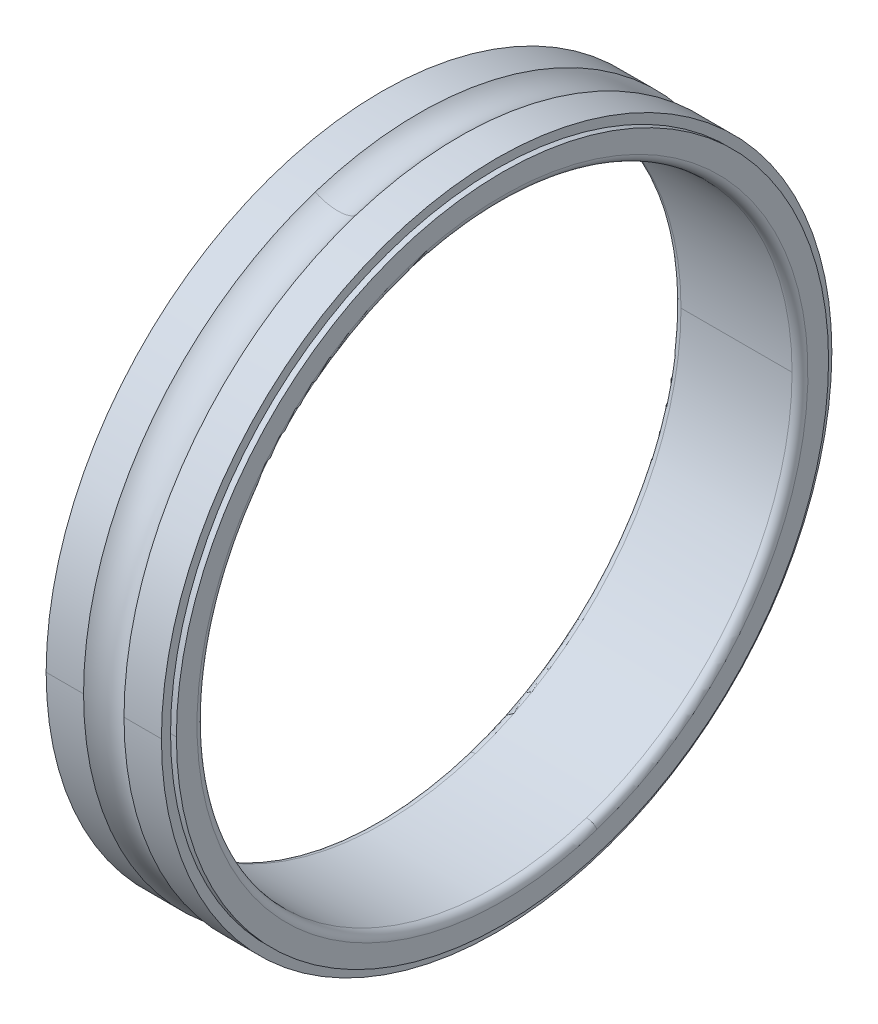
ISO-10303-21;
HEADER;
FILE_DESCRIPTION(('STEP AP214'),'2;1');
FILE_NAME('part.step','',(''),(''),'','','');
FILE_SCHEMA(('AUTOMOTIVE_DESIGN { 1 0 10303 214 1 1 1 1 }'));
ENDSEC;
DATA;
#1=APPLICATION_CONTEXT('core data for automotive mechanical design processes');
#2=APPLICATION_PROTOCOL_DEFINITION('international standard','automotive_design',2000,#1);
#3=PRODUCT_CONTEXT('',#1,'mechanical');
#4=PRODUCT('Part','Part','',(#3));
#5=PRODUCT_RELATED_PRODUCT_CATEGORY('part','',(#4));
#6=PRODUCT_DEFINITION_FORMATION('','',#4);
#7=PRODUCT_DEFINITION_CONTEXT('part definition',#1,'design');
#8=PRODUCT_DEFINITION('design','',#6,#7);
#9=PRODUCT_DEFINITION_SHAPE('','',#8);
#10=(LENGTH_UNIT() NAMED_UNIT(*) SI_UNIT(.MILLI.,.METRE.));
#11=(NAMED_UNIT(*) PLANE_ANGLE_UNIT() SI_UNIT($,.RADIAN.));
#12=(NAMED_UNIT(*) SI_UNIT($,.STERADIAN.) SOLID_ANGLE_UNIT());
#13=UNCERTAINTY_MEASURE_WITH_UNIT(LENGTH_MEASURE(1.E-05),#10,'distance_accuracy_value','');
#14=(GEOMETRIC_REPRESENTATION_CONTEXT(3) GLOBAL_UNCERTAINTY_ASSIGNED_CONTEXT((#13)) GLOBAL_UNIT_ASSIGNED_CONTEXT((#10,
#11,#12)) REPRESENTATION_CONTEXT('',''));
#15=CARTESIAN_POINT('',(0.,0.,0.));
#16=DIRECTION('',(0.,0.,1.));
#17=DIRECTION('',(1.,0.,0.));
#18=AXIS2_PLACEMENT_3D('',#15,#16,#17);
#19=CARTESIAN_POINT('',(0.,41.1,0.));
#20=DIRECTION('',(-1.,0.,0.));
#21=DIRECTION('',(0.,0.,1.));
#22=AXIS2_PLACEMENT_3D('',#19,#20,#21);
#23=PLANE('',#22);
#24=CARTESIAN_POINT('',(0.,0.,0.));
#25=DIRECTION('',(1.,0.,0.));
#26=DIRECTION('',(0.,0.,-1.));
#27=AXIS2_PLACEMENT_3D('',#24,#25,#26);
#28=CIRCLE('',#27,38.5);
#29=CARTESIAN_POINT('',(0.,36.6156758773627,11.8971542834352));
#30=VERTEX_POINT('',#29);
#31=CARTESIAN_POINT('',(0.,-36.6156758773627,-11.8971542834352));
#32=VERTEX_POINT('',#31);
#33=EDGE_CURVE('E11',#30,#32,#28,.T.);
#34=ORIENTED_EDGE('',*,*,#33,.T.);
#35=CARTESIAN_POINT('',(0.,-36.6156758773634,-11.8971542834355));
#36=CARTESIAN_POINT('',(0.,-34.7467993491149,-17.6486773846907));
#37=CARTESIAN_POINT('',(0.,-31.7490790347985,-23.033596239399));
#38=CARTESIAN_POINT('',(0.,-27.7165310905303,-27.75484879996));
#39=CARTESIAN_POINT('',(0.,-18.0176132621773,-35.3615435813049));
#40=CARTESIAN_POINT('',(0.,-6.16277934500541,-38.7370687624389));
#41=CARTESIAN_POINT('',(0.,0.0270961919416127,-39.2242330875805));
#42=CARTESIAN_POINT('',(0.,12.2640082401008,-37.7447362603399));
#43=CARTESIAN_POINT('',(0.,23.0335044615987,-31.7489979011934));
#44=CARTESIAN_POINT('',(0.,27.7548709582933,-27.7165561289571));
#45=CARTESIAN_POINT('',(0.,35.3615491425654,-18.017602347589));
#46=CARTESIAN_POINT('',(0.,38.7370354815845,-6.16277613575522));
#47=CARTESIAN_POINT('',(0.,39.2243526716834,0.0270696312780743));
#48=CARTESIAN_POINT('',(0.,38.4843834627591,6.14557628931974));
#49=CARTESIAN_POINT('',(0.,36.6156758773634,11.8971542834355));
#50=B_SPLINE_CURVE_WITH_KNOTS('',5,(#35,#36,#37,#38,#39,#40,#41,#42,#43,#44,#45,#46,#47,#48,
#49),.UNSPECIFIED.,.F.,.F.,(6,3,3,3,6),(0.,0.785398163397448,1.5707963267949,2.35619449019234,
3.14159265358979),.UNSPECIFIED.);
#51=EDGE_CURVE('E28',#32,#30,#50,.T.);
#52=ORIENTED_EDGE('',*,*,#51,.T.);
#53=EDGE_LOOP('',(#34,#52));
#54=FACE_BOUND('',#53,.T.);
#55=CARTESIAN_POINT('',(0.,0.,0.));
#56=DIRECTION('',(1.,0.,0.));
#57=DIRECTION('',(0.,0.,-1.));
#58=AXIS2_PLACEMENT_3D('',#55,#56,#57);
#59=CIRCLE('',#58,41.1);
#60=CARTESIAN_POINT('',(0.,0.,41.1));
#61=VERTEX_POINT('',#60);
#62=CARTESIAN_POINT('',(0.,0.,-41.1));
#63=VERTEX_POINT('',#62);
#64=EDGE_CURVE('E402',#61,#63,#59,.T.);
#65=ORIENTED_EDGE('',*,*,#64,.F.);
#66=CARTESIAN_POINT('',(0.,0.,0.));
#67=DIRECTION('',(1.,0.,0.));
#68=DIRECTION('',(0.,0.,-1.));
#69=AXIS2_PLACEMENT_3D('',#66,#67,#68);
#70=CIRCLE('',#69,41.1);
#71=EDGE_CURVE('E397',#63,#61,#70,.T.);
#72=ORIENTED_EDGE('',*,*,#71,.F.);
#73=EDGE_LOOP('',(#65,#72));
#74=FACE_BOUND('',#73,.T.);
#75=ADVANCED_FACE('F19',(#54,#74),#23,.T.);
#76=CARTESIAN_POINT('',(16.,0.,0.));
#77=DIRECTION('',(1.,0.,0.));
#78=DIRECTION('',(0.,-1.,0.));
#79=AXIS2_PLACEMENT_3D('',#76,#77,#78);
#80=CYLINDRICAL_SURFACE('',#79,41.1);
#81=DIRECTION('',(1.,0.,0.));
#82=VECTOR('',#81,1.);
#83=CARTESIAN_POINT('',(0.,0.,41.1));
#84=LINE('',#83,#82);
#85=CARTESIAN_POINT('',(0.736000000000001,0.,41.1));
#86=VERTEX_POINT('',#85);
#87=EDGE_CURVE('E393',#61,#86,#84,.T.);
#88=ORIENTED_EDGE('',*,*,#87,.T.);
#89=CARTESIAN_POINT('',(0.736,0.,0.));
#90=DIRECTION('',(1.,0.,0.));
#91=DIRECTION('',(0.,0.,-1.));
#92=AXIS2_PLACEMENT_3D('',#89,#90,#91);
#93=CIRCLE('',#92,41.1);
#94=CARTESIAN_POINT('',(0.736,0.,-41.1));
#95=VERTEX_POINT('',#94);
#96=EDGE_CURVE('E388',#95,#86,#93,.T.);
#97=ORIENTED_EDGE('',*,*,#96,.F.);
#98=DIRECTION('',(1.,0.,0.));
#99=VECTOR('',#98,1.);
#100=CARTESIAN_POINT('',(0.,0.,-41.1));
#101=LINE('',#100,#99);
#102=EDGE_CURVE('E383',#63,#95,#101,.T.);
#103=ORIENTED_EDGE('',*,*,#102,.F.);
#104=ORIENTED_EDGE('',*,*,#71,.T.);
#105=EDGE_LOOP('',(#88,#97,#103,#104));
#106=FACE_BOUND('',#105,.T.);
#107=ADVANCED_FACE('F423',(#106),#80,.T.);
#108=CARTESIAN_POINT('',(16.,0.,0.));
#109=DIRECTION('',(1.,0.,0.));
#110=DIRECTION('',(0.,1.,0.));
#111=AXIS2_PLACEMENT_3D('',#108,#109,#110);
#112=CYLINDRICAL_SURFACE('',#111,41.1);
#113=ORIENTED_EDGE('',*,*,#87,.F.);
#114=ORIENTED_EDGE('',*,*,#64,.T.);
#115=ORIENTED_EDGE('',*,*,#102,.T.);
#116=CARTESIAN_POINT('',(0.736,0.,0.));
#117=DIRECTION('',(1.,0.,0.));
#118=DIRECTION('',(0.,0.,-1.));
#119=AXIS2_PLACEMENT_3D('',#116,#117,#118);
#120=CIRCLE('',#119,41.1);
#121=EDGE_CURVE('E378',#86,#95,#120,.T.);
#122=ORIENTED_EDGE('',*,*,#121,.F.);
#123=EDGE_LOOP('',(#113,#114,#115,#122));
#124=FACE_BOUND('',#123,.T.);
#125=ADVANCED_FACE('F418',(#124),#112,.T.);
#126=CARTESIAN_POINT('',(0.736,42.25,0.));
#127=DIRECTION('',(-1.,0.,0.));
#128=DIRECTION('',(0.,0.,1.));
#129=AXIS2_PLACEMENT_3D('',#126,#127,#128);
#130=PLANE('',#129);
#131=ORIENTED_EDGE('',*,*,#96,.T.);
#132=ORIENTED_EDGE('',*,*,#121,.T.);
#133=EDGE_LOOP('',(#131,#132));
#134=FACE_BOUND('',#133,.T.);
#135=CARTESIAN_POINT('',(0.736,0.,0.));
#136=DIRECTION('',(1.,0.,0.));
#137=DIRECTION('',(0.,0.,-1.));
#138=AXIS2_PLACEMENT_3D('',#135,#136,#137);
#139=CIRCLE('',#138,42.25);
#140=CARTESIAN_POINT('',(0.736000000000001,0.,42.25));
#141=VERTEX_POINT('',#140);
#142=CARTESIAN_POINT('',(0.736,0.,-42.25));
#143=VERTEX_POINT('',#142);
#144=EDGE_CURVE('E373',#141,#143,#139,.T.);
#145=ORIENTED_EDGE('',*,*,#144,.F.);
#146=CARTESIAN_POINT('',(0.736,0.,0.));
#147=DIRECTION('',(1.,0.,0.));
#148=DIRECTION('',(0.,0.,-1.));
#149=AXIS2_PLACEMENT_3D('',#146,#147,#148);
#150=CIRCLE('',#149,42.25);
#151=EDGE_CURVE('E368',#143,#141,#150,.T.);
#152=ORIENTED_EDGE('',*,*,#151,.F.);
#153=EDGE_LOOP('',(#145,#152));
#154=FACE_BOUND('',#153,.T.);
#155=ADVANCED_FACE('F425',(#134,#154),#130,.T.);
#156=CARTESIAN_POINT('',(16.,0.,0.));
#157=DIRECTION('',(1.,0.,0.));
#158=DIRECTION('',(0.,-1.,0.));
#159=AXIS2_PLACEMENT_3D('',#156,#157,#158);
#160=CYLINDRICAL_SURFACE('',#159,42.25);
#161=DIRECTION('',(1.,0.,0.));
#162=VECTOR('',#161,1.);
#163=CARTESIAN_POINT('',(0.736000000000001,0.,42.25));
#164=LINE('',#163,#162);
#165=CARTESIAN_POINT('',(5.4504902432036,0.,42.25));
#166=VERTEX_POINT('',#165);
#167=EDGE_CURVE('E364',#141,#166,#164,.T.);
#168=ORIENTED_EDGE('',*,*,#167,.T.);
#169=CARTESIAN_POINT('',(5.4504902432036,0.,0.));
#170=DIRECTION('',(1.,0.,0.));
#171=DIRECTION('',(0.,0.,-1.));
#172=AXIS2_PLACEMENT_3D('',#169,#170,#171);
#173=CIRCLE('',#172,42.25);
#174=CARTESIAN_POINT('',(5.4504902432036,40.1821378134702,13.0559680123415));
#175=VERTEX_POINT('',#174);
#176=EDGE_CURVE('E359',#175,#166,#173,.T.);
#177=ORIENTED_EDGE('',*,*,#176,.F.);
#178=CARTESIAN_POINT('',(5.4504902432036,0.,0.));
#179=DIRECTION('',(1.,0.,0.));
#180=DIRECTION('',(0.,0.,-1.));
#181=AXIS2_PLACEMENT_3D('',#178,#179,#180);
#182=CIRCLE('',#181,42.25);
#183=CARTESIAN_POINT('',(5.4504902432036,0.,-42.25));
#184=VERTEX_POINT('',#183);
#185=EDGE_CURVE('E354',#184,#175,#182,.T.);
#186=ORIENTED_EDGE('',*,*,#185,.F.);
#187=DIRECTION('',(1.,0.,0.));
#188=VECTOR('',#187,1.);
#189=CARTESIAN_POINT('',(0.736000000000001,0.,-42.25));
#190=LINE('',#189,#188);
#191=EDGE_CURVE('E349',#143,#184,#190,.T.);
#192=ORIENTED_EDGE('',*,*,#191,.F.);
#193=ORIENTED_EDGE('',*,*,#151,.T.);
#194=EDGE_LOOP('',(#168,#177,#186,#192,#193));
#195=FACE_BOUND('',#194,.T.);
#196=ADVANCED_FACE('F428',(#195),#160,.T.);
#197=CARTESIAN_POINT('',(16.,0.,0.));
#198=DIRECTION('',(1.,0.,0.));
#199=DIRECTION('',(0.,1.,0.));
#200=AXIS2_PLACEMENT_3D('',#197,#198,#199);
#201=CYLINDRICAL_SURFACE('',#200,42.25);
#202=ORIENTED_EDGE('',*,*,#167,.F.);
#203=ORIENTED_EDGE('',*,*,#144,.T.);
#204=ORIENTED_EDGE('',*,*,#191,.T.);
#205=CARTESIAN_POINT('',(5.4504902432036,0.,0.));
#206=DIRECTION('',(1.,0.,0.));
#207=DIRECTION('',(0.,0.,-1.));
#208=AXIS2_PLACEMENT_3D('',#205,#206,#207);
#209=CIRCLE('',#208,42.25);
#210=CARTESIAN_POINT('',(5.4504902432036,-40.1821378134702,-13.0559680123415));
#211=VERTEX_POINT('',#210);
#212=EDGE_CURVE('E344',#211,#184,#209,.T.);
#213=ORIENTED_EDGE('',*,*,#212,.F.);
#214=CARTESIAN_POINT('',(5.4504902432036,0.,0.));
#215=DIRECTION('',(1.,0.,0.));
#216=DIRECTION('',(0.,0.,-1.));
#217=AXIS2_PLACEMENT_3D('',#214,#215,#216);
#218=CIRCLE('',#217,42.25);
#219=EDGE_CURVE('E339',#166,#211,#218,.T.);
#220=ORIENTED_EDGE('',*,*,#219,.F.);
#221=EDGE_LOOP('',(#202,#203,#204,#213,#220));
#222=FACE_BOUND('',#221,.T.);
#223=ADVANCED_FACE('F434',(#222),#201,.T.);
#224=CARTESIAN_POINT('',(7.9999999999998,0.,0.));
#225=DIRECTION('',(1.,0.,0.));
#226=DIRECTION('',(0.,0.309016994374947,-0.951056516295154));
#227=AXIS2_PLACEMENT_3D('',#224,#225,#226);
#228=TOROIDAL_SURFACE('',#227,44.9999999999995,3.74999999999951);
#229=CARTESIAN_POINT('',(7.9999999999998,-42.7975432332814,-13.9057647468725));
#230=DIRECTION('',(0.,0.309016994374947,-0.951056516295154));
#231=DIRECTION('',(-0.679869268479076,0.697441445283079,0.226612462541617));
#232=AXIS2_PLACEMENT_3D('',#229,#230,#231);
#233=CIRCLE('',#232,3.74999999999951);
#234=CARTESIAN_POINT('',(10.549509756796,-40.1821378134702,-13.0559680123415));
#235=VERTEX_POINT('',#234);
#236=EDGE_CURVE('E335',#211,#235,#233,.T.);
#237=ORIENTED_EDGE('',*,*,#236,.T.);
#238=CARTESIAN_POINT('',(10.549509756796,0.,0.));
#239=DIRECTION('',(1.,0.,0.));
#240=DIRECTION('',(0.,0.,-1.));
#241=AXIS2_PLACEMENT_3D('',#238,#239,#240);
#242=CIRCLE('',#241,42.25);
#243=CARTESIAN_POINT('',(10.549509756796,0.,42.25));
#244=VERTEX_POINT('',#243);
#245=EDGE_CURVE('E330',#244,#235,#242,.T.);
#246=ORIENTED_EDGE('',*,*,#245,.F.);
#247=CARTESIAN_POINT('',(10.549509756796,0.,0.));
#248=DIRECTION('',(1.,0.,0.));
#249=DIRECTION('',(0.,0.,-1.));
#250=AXIS2_PLACEMENT_3D('',#247,#248,#249);
#251=CIRCLE('',#250,42.25);
#252=CARTESIAN_POINT('',(10.549509756796,40.1821378134702,13.0559680123415));
#253=VERTEX_POINT('',#252);
#254=EDGE_CURVE('E325',#253,#244,#251,.T.);
#255=ORIENTED_EDGE('',*,*,#254,.F.);
#256=CARTESIAN_POINT('',(7.9999999999998,42.7975432332814,13.9057647468725));
#257=DIRECTION('',(0.,-0.309016994374947,0.951056516295154));
#258=DIRECTION('',(-0.679869268479078,-0.697441445283077,-0.226612462541617));
#259=AXIS2_PLACEMENT_3D('',#256,#257,#258);
#260=CIRCLE('',#259,3.74999999999951);
#261=EDGE_CURVE('E320',#175,#253,#260,.T.);
#262=ORIENTED_EDGE('',*,*,#261,.F.);
#263=ORIENTED_EDGE('',*,*,#176,.T.);
#264=ORIENTED_EDGE('',*,*,#219,.T.);
#265=EDGE_LOOP('',(#237,#246,#255,#262,#263,#264));
#266=FACE_BOUND('',#265,.T.);
#267=ADVANCED_FACE('F441',(#266),#228,.F.);
#268=CARTESIAN_POINT('',(7.9999999999998,0.,0.));
#269=DIRECTION('',(1.,0.,0.));
#270=DIRECTION('',(0.,-0.309016994374947,0.951056516295154));
#271=AXIS2_PLACEMENT_3D('',#268,#269,#270);
#272=TOROIDAL_SURFACE('',#271,44.9999999999995,3.74999999999951);
#273=ORIENTED_EDGE('',*,*,#236,.F.);
#274=ORIENTED_EDGE('',*,*,#212,.T.);
#275=ORIENTED_EDGE('',*,*,#185,.T.);
#276=ORIENTED_EDGE('',*,*,#261,.T.);
#277=CARTESIAN_POINT('',(10.549509756796,0.,0.));
#278=DIRECTION('',(1.,0.,0.));
#279=DIRECTION('',(0.,0.,-1.));
#280=AXIS2_PLACEMENT_3D('',#277,#278,#279);
#281=CIRCLE('',#280,42.25);
#282=CARTESIAN_POINT('',(10.549509756796,0.,-42.25));
#283=VERTEX_POINT('',#282);
#284=EDGE_CURVE('E315',#283,#253,#281,.T.);
#285=ORIENTED_EDGE('',*,*,#284,.F.);
#286=CARTESIAN_POINT('',(10.549509756796,0.,0.));
#287=DIRECTION('',(1.,0.,0.));
#288=DIRECTION('',(0.,0.,-1.));
#289=AXIS2_PLACEMENT_3D('',#286,#287,#288);
#290=CIRCLE('',#289,42.25);
#291=EDGE_CURVE('E310',#235,#283,#290,.T.);
#292=ORIENTED_EDGE('',*,*,#291,.F.);
#293=EDGE_LOOP('',(#273,#274,#275,#276,#285,#292));
#294=FACE_BOUND('',#293,.T.);
#295=ADVANCED_FACE('F438',(#294),#272,.F.);
#296=CARTESIAN_POINT('',(16.,0.,0.));
#297=DIRECTION('',(1.,0.,0.));
#298=DIRECTION('',(0.,1.,0.));
#299=AXIS2_PLACEMENT_3D('',#296,#297,#298);
#300=CYLINDRICAL_SURFACE('',#299,42.25);
#301=DIRECTION('',(1.,0.,0.));
#302=VECTOR('',#301,1.);
#303=CARTESIAN_POINT('',(10.549509756796,0.,42.25));
#304=LINE('',#303,#302);
#305=CARTESIAN_POINT('',(15.264,0.,42.25));
#306=VERTEX_POINT('',#305);
#307=EDGE_CURVE('E305',#244,#306,#304,.T.);
#308=ORIENTED_EDGE('',*,*,#307,.F.);
#309=ORIENTED_EDGE('',*,*,#245,.T.);
#310=ORIENTED_EDGE('',*,*,#291,.T.);
#311=DIRECTION('',(1.,0.,0.));
#312=VECTOR('',#311,1.);
#313=CARTESIAN_POINT('',(10.549509756796,0.,-42.25));
#314=LINE('',#313,#312);
#315=CARTESIAN_POINT('',(15.264,0.,-42.25));
#316=VERTEX_POINT('',#315);
#317=EDGE_CURVE('E301',#283,#316,#314,.T.);
#318=ORIENTED_EDGE('',*,*,#317,.T.);
#319=CARTESIAN_POINT('',(15.264,0.,0.));
#320=DIRECTION('',(1.,0.,0.));
#321=DIRECTION('',(0.,0.,-1.));
#322=AXIS2_PLACEMENT_3D('',#319,#320,#321);
#323=CIRCLE('',#322,42.25);
#324=EDGE_CURVE('E296',#306,#316,#323,.T.);
#325=ORIENTED_EDGE('',*,*,#324,.F.);
#326=EDGE_LOOP('',(#308,#309,#310,#318,#325));
#327=FACE_BOUND('',#326,.T.);
#328=ADVANCED_FACE('F447',(#327),#300,.T.);
#329=CARTESIAN_POINT('',(15.264,41.1,0.));
#330=DIRECTION('',(1.,0.,0.));
#331=DIRECTION('',(0.,0.,-1.));
#332=AXIS2_PLACEMENT_3D('',#329,#330,#331);
#333=PLANE('',#332);
#334=CARTESIAN_POINT('',(15.264,0.,0.));
#335=DIRECTION('',(1.,0.,0.));
#336=DIRECTION('',(0.,0.,-1.));
#337=AXIS2_PLACEMENT_3D('',#334,#335,#336);
#338=CIRCLE('',#337,42.25);
#339=EDGE_CURVE('E291',#316,#306,#338,.T.);
#340=ORIENTED_EDGE('',*,*,#339,.T.);
#341=ORIENTED_EDGE('',*,*,#324,.T.);
#342=EDGE_LOOP('',(#340,#341));
#343=FACE_BOUND('',#342,.T.);
#344=CARTESIAN_POINT('',(15.264,0.,0.));
#345=DIRECTION('',(1.,0.,0.));
#346=DIRECTION('',(0.,0.,-1.));
#347=AXIS2_PLACEMENT_3D('',#344,#345,#346);
#348=CIRCLE('',#347,41.1);
#349=CARTESIAN_POINT('',(15.264,0.,41.1));
#350=VERTEX_POINT('',#349);
#351=CARTESIAN_POINT('',(15.264,0.,-41.1));
#352=VERTEX_POINT('',#351);
#353=EDGE_CURVE('E286',#350,#352,#348,.T.);
#354=ORIENTED_EDGE('',*,*,#353,.F.);
#355=CARTESIAN_POINT('',(15.264,0.,0.));
#356=DIRECTION('',(1.,0.,0.));
#357=DIRECTION('',(0.,0.,-1.));
#358=AXIS2_PLACEMENT_3D('',#355,#356,#357);
#359=CIRCLE('',#358,41.1);
#360=EDGE_CURVE('E281',#352,#350,#359,.T.);
#361=ORIENTED_EDGE('',*,*,#360,.F.);
#362=EDGE_LOOP('',(#354,#361));
#363=FACE_BOUND('',#362,.T.);
#364=ADVANCED_FACE('F451',(#343,#363),#333,.T.);
#365=CARTESIAN_POINT('',(16.,0.,0.));
#366=DIRECTION('',(1.,0.,0.));
#367=DIRECTION('',(0.,-1.,0.));
#368=AXIS2_PLACEMENT_3D('',#365,#366,#367);
#369=CYLINDRICAL_SURFACE('',#368,41.1);
#370=DIRECTION('',(1.,0.,0.));
#371=VECTOR('',#370,1.);
#372=CARTESIAN_POINT('',(15.264,0.,41.1));
#373=LINE('',#372,#371);
#374=CARTESIAN_POINT('',(16.,0.,41.1));
#375=VERTEX_POINT('',#374);
#376=EDGE_CURVE('E277',#350,#375,#373,.T.);
#377=ORIENTED_EDGE('',*,*,#376,.T.);
#378=CARTESIAN_POINT('',(16.,0.,0.));
#379=DIRECTION('',(1.,0.,0.));
#380=DIRECTION('',(0.,0.,-1.));
#381=AXIS2_PLACEMENT_3D('',#378,#379,#380);
#382=CIRCLE('',#381,41.1);
#383=CARTESIAN_POINT('',(16.,0.,-41.1));
#384=VERTEX_POINT('',#383);
#385=EDGE_CURVE('E272',#384,#375,#382,.T.);
#386=ORIENTED_EDGE('',*,*,#385,.F.);
#387=DIRECTION('',(1.,0.,0.));
#388=VECTOR('',#387,1.);
#389=CARTESIAN_POINT('',(15.264,0.,-41.1));
#390=LINE('',#389,#388);
#391=EDGE_CURVE('E267',#352,#384,#390,.T.);
#392=ORIENTED_EDGE('',*,*,#391,.F.);
#393=ORIENTED_EDGE('',*,*,#360,.T.);
#394=EDGE_LOOP('',(#377,#386,#392,#393));
#395=FACE_BOUND('',#394,.T.);
#396=ADVANCED_FACE('F454',(#395),#369,.T.);
#397=CARTESIAN_POINT('',(16.,0.,0.));
#398=DIRECTION('',(1.,0.,0.));
#399=DIRECTION('',(0.,1.,0.));
#400=AXIS2_PLACEMENT_3D('',#397,#398,#399);
#401=CYLINDRICAL_SURFACE('',#400,41.1);
#402=ORIENTED_EDGE('',*,*,#376,.F.);
#403=ORIENTED_EDGE('',*,*,#353,.T.);
#404=ORIENTED_EDGE('',*,*,#391,.T.);
#405=CARTESIAN_POINT('',(16.,0.,0.));
#406=DIRECTION('',(1.,0.,0.));
#407=DIRECTION('',(0.,0.,-1.));
#408=AXIS2_PLACEMENT_3D('',#405,#406,#407);
#409=CIRCLE('',#408,41.1);
#410=EDGE_CURVE('E264',#375,#384,#409,.T.);
#411=ORIENTED_EDGE('',*,*,#410,.F.);
#412=EDGE_LOOP('',(#402,#403,#404,#411));
#413=FACE_BOUND('',#412,.T.);
#414=ADVANCED_FACE('F460',(#413),#401,.T.);
#415=CARTESIAN_POINT('',(16.,38.5,0.));
#416=DIRECTION('',(1.,0.,0.));
#417=DIRECTION('',(0.,0.,-1.));
#418=AXIS2_PLACEMENT_3D('',#415,#416,#417);
#419=PLANE('',#418);
#420=ORIENTED_EDGE('',*,*,#385,.T.);
#421=ORIENTED_EDGE('',*,*,#410,.T.);
#422=EDGE_LOOP('',(#420,#421));
#423=FACE_BOUND('',#422,.T.);
#424=CARTESIAN_POINT('',(16.,-36.6156758773619,-11.8971542834351));
#425=CARTESIAN_POINT('',(16.,-36.4210216579228,-12.4962816133549));
#426=CARTESIAN_POINT('',(16.,-36.2116381436891,-13.0906219097157));
#427=CARTESIAN_POINT('',(16.,-35.7639718570865,-14.2683174888754));
#428=CARTESIAN_POINT('',(16.,-35.5256890847176,-14.8516727716743));
#429=CARTESIAN_POINT('',(16.,-35.020783613299,-16.0059873772664));
#430=CARTESIAN_POINT('',(16.,-34.7541609142492,-16.5769467000597));
#431=CARTESIAN_POINT('',(16.,-34.1932218491376,-17.7050953931201));
#432=CARTESIAN_POINT('',(16.,-33.8989054830758,-18.2622847633872));
#433=CARTESIAN_POINT('',(16.,-33.2832870615268,-19.3615508318769));
#434=CARTESIAN_POINT('',(16.,-32.9619850060396,-19.9036275300995));
#435=CARTESIAN_POINT('',(16.,-32.2931695334738,-20.9713624518412));
#436=CARTESIAN_POINT('',(16.,-31.9456561163952,-21.4970206753602));
#437=CARTESIAN_POINT('',(16.,-31.2252550350668,-22.5306522621642));
#438=CARTESIAN_POINT('',(16.,-30.8523673708169,-23.0386256254491));
#439=CARTESIAN_POINT('',(16.,-30.0821161345115,-24.0356637471839));
#440=CARTESIAN_POINT('',(16.,-29.6847525624559,-24.5247285056337));
#441=CARTESIAN_POINT('',(16.,-28.8665067887441,-25.4827712157885));
#442=CARTESIAN_POINT('',(16.,-28.4456245870878,-25.9517491674933));
#443=CARTESIAN_POINT('',(16.,-27.5813554977222,-26.8684884557494));
#444=CARTESIAN_POINT('',(16.,-27.1379686100129,-27.3162497923007));
#445=CARTESIAN_POINT('',(16.,-26.2297583059989,-28.1894771538219));
#446=CARTESIAN_POINT('',(16.,-25.7649348896942,-28.6149431787919));
#447=CARTESIAN_POINT('',(16.,-24.8149713289179,-29.4425549322698));
#448=CARTESIAN_POINT('',(16.,-24.3298311844462,-29.8447006607778));
#449=CARTESIAN_POINT('',(16.,-23.3404029124091,-30.6247030170372));
#450=CARTESIAN_POINT('',(16.,-22.8361147848436,-31.0025596447887));
#451=CARTESIAN_POINT('',(16.,-21.8096054208961,-31.7330735098255));
#452=CARTESIAN_POINT('',(16.,-21.2873841845141,-32.0857307471108));
#453=CARTESIAN_POINT('',(16.,-20.2262666796312,-32.7649962490407));
#454=CARTESIAN_POINT('',(16.,-19.6873704111303,-33.0916045136853));
#455=CARTESIAN_POINT('',(16.,-18.5942010903226,-33.7179852424169));
#456=CARTESIAN_POINT('',(16.,-18.0399280380158,-34.017757706504));
#457=CARTESIAN_POINT('',(16.,-16.9173404419279,-34.5897446559976));
#458=CARTESIAN_POINT('',(16.,-16.3490258981467,-34.8619591414041));
#459=CARTESIAN_POINT('',(16.,-15.1997244386245,-35.3781743449981));
#460=CARTESIAN_POINT('',(16.,-14.6187375228835,-35.6221750631856));
#461=CARTESIAN_POINT('',(16.,-13.4454909678099,-36.0813749132394));
#462=CARTESIAN_POINT('',(16.,-12.8532313284774,-36.2965740451058));
#463=CARTESIAN_POINT('',(16.,-11.6588661315679,-36.6976522889596));
#464=CARTESIAN_POINT('',(16.,-11.0567605739909,-36.883531400947));
#465=CARTESIAN_POINT('',(16.,-9.84415406561893,-37.2255218059809));
#466=CARTESIAN_POINT('',(16.,-9.2336531148239,-37.3816330990274));
#467=CARTESIAN_POINT('',(16.,-8.0057265702798,-37.663711780401));
#468=CARTESIAN_POINT('',(16.,-7.38830097653074,-37.789679168728));
#469=CARTESIAN_POINT('',(16.,-6.14801257841404,-38.0111665741906));
#470=CARTESIAN_POINT('',(16.,-5.52514977404639,-38.1066865913261));
#471=CARTESIAN_POINT('',(16.,-4.27548748574457,-38.267049138318));
#472=CARTESIAN_POINT('',(16.,-3.64868800181039,-38.3318916681743));
#473=CARTESIAN_POINT('',(16.,-2.39266236923345,-38.4307430292735));
#474=CARTESIAN_POINT('',(16.,-1.76343622059069,-38.4647518605165));
#475=CARTESIAN_POINT('',(16.,-0.504073119502389,-38.501853894136));
#476=CARTESIAN_POINT('',(16.,0.126063832943155,-38.5049470965125));
#477=CARTESIAN_POINT('',(16.,1.38573048652513,-38.4802104206034));
#478=CARTESIAN_POINT('',(16.,2.01526018766156,-38.4523805423179));
#479=CARTESIAN_POINT('',(16.,3.27219574643497,-38.3658647496992));
#480=CARTESIAN_POINT('',(16.,3.89960160407194,-38.3071788353661));
#481=CARTESIAN_POINT('',(16.,5.15077800018113,-38.1590923501602));
#482=CARTESIAN_POINT('',(16.,5.77454853865335,-38.0696917792873));
#483=CARTESIAN_POINT('',(16.,7.01695157857,-37.8603913548078));
#484=CARTESIAN_POINT('',(16.,7.63558408001444,-37.7404915012011));
#485=CARTESIAN_POINT('',(16.,8.86622070599374,-37.4704813605031));
#486=CARTESIAN_POINT('',(16.,9.4782248305286,-37.3203710734118));
#487=CARTESIAN_POINT('',(16.,10.6941303311475,-36.9903016945744));
#488=CARTESIAN_POINT('',(16.,11.2980317072316,-36.8103426028282));
#489=CARTESIAN_POINT('',(16.,12.4962768596384,-36.4210091518957));
#490=CARTESIAN_POINT('',(16.,13.0906206359611,-36.2116347927092));
#491=CARTESIAN_POINT('',(16.,14.2683187626298,-35.7639752080664));
#492=CARTESIAN_POINT('',(16.,14.8516731129757,-35.52568998261));
#493=CARTESIAN_POINT('',(16.,16.0059870359649,-35.0207827154067));
#494=CARTESIAN_POINT('',(16.,16.5769466086082,-34.7541606736597));
#495=CARTESIAN_POINT('',(16.,17.7050954845714,-34.1932220897272));
#496=CARTESIAN_POINT('',(16.,18.2622847878914,-33.8989055475417));
#497=CARTESIAN_POINT('',(16.,19.3615508073725,-33.2832869970611));
#498=CARTESIAN_POINT('',(16.,19.9036275235335,-32.9619849887661));
#499=CARTESIAN_POINT('',(16.,20.971362458407,-32.2931695507474));
#500=CARTESIAN_POINT('',(16.,21.4970206771195,-31.9456561210237));
#501=CARTESIAN_POINT('',(16.,22.5306522604048,-31.2252550304384));
#502=CARTESIAN_POINT('',(16.,23.0386256249777,-30.8523673695768));
#503=CARTESIAN_POINT('',(16.,24.0356637476552,-30.0821161357517));
#504=CARTESIAN_POINT('',(16.,24.52472850576,-29.6847525627883));
#505=CARTESIAN_POINT('',(16.,25.4827712156621,-28.8665067884118));
#506=CARTESIAN_POINT('',(16.,25.9517491674594,-28.4456245869988));
#507=CARTESIAN_POINT('',(16.,26.8684884557832,-27.5813554978113));
#508=CARTESIAN_POINT('',(16.,27.3162497923097,-27.1379686100368));
#509=CARTESIAN_POINT('',(16.,28.1894771538127,-26.2297583059751));
#510=CARTESIAN_POINT('',(16.,28.6149431787894,-25.7649348896879));
#511=CARTESIAN_POINT('',(16.,29.4425549322722,-24.8149713289244));
#512=CARTESIAN_POINT('',(16.,29.8447006607783,-24.329831184448));
#513=CARTESIAN_POINT('',(16.,30.6247030170365,-23.3404029124074));
#514=CARTESIAN_POINT('',(16.,31.0025596447885,-22.8361147848432));
#515=CARTESIAN_POINT('',(16.,31.7330735098256,-21.8096054208967));
#516=CARTESIAN_POINT('',(16.,32.0857307471108,-21.2873841845144));
#517=CARTESIAN_POINT('',(16.,32.7649962490406,-20.2262666796312));
#518=CARTESIAN_POINT('',(16.,33.0916045136852,-19.6873704111303));
#519=CARTESIAN_POINT('',(16.,33.7179852424169,-18.5942010903227));
#520=CARTESIAN_POINT('',(16.,34.017757706504,-18.0399280380159));
#521=CARTESIAN_POINT('',(16.,34.5897446559975,-16.917340441928));
#522=CARTESIAN_POINT('',(16.,34.861959141404,-16.3490258981468));
#523=CARTESIAN_POINT('',(16.,35.3781743449981,-15.1997244386246));
#524=CARTESIAN_POINT('',(16.,35.6221750631857,-14.6187375228835));
#525=CARTESIAN_POINT('',(16.,36.0813749132393,-13.44549096781));
#526=CARTESIAN_POINT('',(16.,36.2965740451053,-12.8532313284776));
#527=CARTESIAN_POINT('',(16.,36.69765228896,-11.6588661315679));
#528=CARTESIAN_POINT('',(16.,36.8835314009487,-11.0567605739906));
#529=CARTESIAN_POINT('',(16.,37.2255218059791,-9.84415406561952));
#530=CARTESIAN_POINT('',(16.,37.3816330990208,-9.23365311482579));
#531=CARTESIAN_POINT('',(16.,37.6637117804076,-8.00572657027811));
#532=CARTESIAN_POINT('',(16.,37.7896791687526,-7.38830097652416));
#533=CARTESIAN_POINT('',(16.,38.0111665741659,-6.14801257842083));
#534=CARTESIAN_POINT('',(16.,38.1066865912342,-5.52514977407145));
#535=CARTESIAN_POINT('',(16.,38.2670491384099,-4.27548748571972));
#536=CARTESIAN_POINT('',(16.,38.3318916685173,-3.64868800171737));
#537=CARTESIAN_POINT('',(16.,38.4307430289304,-2.39266236932671));
#538=CARTESIAN_POINT('',(16.,38.4647518592361,-1.76343622093841));
#539=CARTESIAN_POINT('',(16.,38.5018538954164,-0.504073119154941));
#540=CARTESIAN_POINT('',(16.,38.5049471012911,0.126063834240221));
#541=CARTESIAN_POINT('',(16.,38.4802104158248,1.38573048522781));
#542=CARTESIAN_POINT('',(16.,38.4523805244839,2.01526018282023));
#543=CARTESIAN_POINT('',(16.,38.3658647675332,3.27219575127604));
#544=CARTESIAN_POINT('',(16.,38.3071789019233,3.89960162213943));
#545=CARTESIAN_POINT('',(16.,38.159092283603,5.15077798211344));
#546=CARTESIAN_POINT('',(16.,38.0696915308925,5.77454847122406));
#547=CARTESIAN_POINT('',(16.,37.8603916032027,7.01695164599911));
#548=CARTESIAN_POINT('',(16.,37.7404924282233,7.63558433166353));
#549=CARTESIAN_POINT('',(16.,37.470480433481,8.86622045434445));
#550=CARTESIAN_POINT('',(16.,37.320367613718,9.47822389136096));
#551=CARTESIAN_POINT('',(16.,36.9903051542682,10.6941312703149));
#552=CARTESIAN_POINT('',(16.,36.8103555145812,11.2980352122524));
#553=CARTESIAN_POINT('',(16.,36.615675877362,11.8971542834349));
#554=B_SPLINE_CURVE_WITH_KNOTS('',3,(#424,#425,#426,#427,#428,#429,#430,#431,#432,#433,#434,
#435,#436,#437,#438,#439,#440,#441,#442,#443,#444,#445,#446,#447,#448,#449,#450,#451,#452,#453,
#454,#455,#456,#457,#458,#459,#460,#461,#462,#463,#464,#465,#466,#467,#468,#469,#470,#471,#472,
#473,#474,#475,#476,#477,#478,#479,#480,#481,#482,#483,#484,#485,#486,#487,#488,#489,#490,#491,
#492,#493,#494,#495,#496,#497,#498,#499,#500,#501,#502,#503,#504,#505,#506,#507,#508,#509,#510,
#511,#512,#513,#514,#515,#516,#517,#518,#519,#520,#521,#522,#523,#524,#525,#526,#527,#528,#529,
#530,#531,#532,#533,#534,#535,#536,#537,#538,#539,#540,#541,#542,#543,#544,#545,#546,#547,#548,
#549,#550,#551,#552,#553),.UNSPECIFIED.,.F.,.F.,(4,2,2,2,2,2,2,2,2,2,2,2,2,2,2,2,2,2,2,2,2,2,2,
2,2,2,2,2,2,2,2,2,2,2,2,2,2,2,2,2,2,2,2,2,2,2,2,2,2,2,2,2,2,2,2,2,2,2,2,2,2,2,2,2,4),(0.,
1.88967459626416,3.77934919252833,5.6690237887925,7.55869838505667,9.44837298132083,
11.338047577585,13.2277221738492,15.1173967701133,17.0070713663775,18.8967459626417,
20.7864205589058,22.67609515517,24.5657697514342,26.4554443476983,28.3451189439625,
30.2347935402267,32.1244681364908,34.014142732755,35.9038173290192,37.7934919252833,
39.6831665215475,41.5728411178117,43.4625157140758,45.35219031034,47.2418649066042,
49.1315395028683,51.0212140991325,52.9108886953967,54.8005632916608,56.690237887925,
58.5799124841892,60.4695870804533,62.3592616767175,64.2489362729817,66.1386108692458,
68.02828546551,69.9179600617742,71.8076346580384,73.6973092543025,75.5869838505667,
77.4766584468308,79.366333043095,81.2560076393592,83.1456822356233,85.0353568318875,
86.9250314281517,88.8147060244158,90.70438062068,92.5940552169442,94.4837298132084,
96.3734044094725,98.2630790057367,100.152753602001,102.042428198265,103.932102794529,
105.821777390793,107.711451987058,109.601126583322,111.490801179586,113.38047577585,
115.270150372114,117.159824968378,119.049499564643,120.939174160907),.UNSPECIFIED.);
#555=CARTESIAN_POINT('',(16.,-36.6156758773619,-11.897154283435));
#556=VERTEX_POINT('',#555);
#557=CARTESIAN_POINT('',(16.,36.6156758773619,11.897154283435));
#558=VERTEX_POINT('',#557);
#559=EDGE_CURVE('E263',#556,#558,#554,.T.);
#560=ORIENTED_EDGE('',*,*,#559,.F.);
#561=CARTESIAN_POINT('',(16.,36.6156758773619,11.8971542834351));
#562=CARTESIAN_POINT('',(16.,36.4210216579228,12.4962816133549));
#563=CARTESIAN_POINT('',(16.,36.2116381436891,13.0906219097157));
#564=CARTESIAN_POINT('',(16.,35.7639718570865,14.2683174888754));
#565=CARTESIAN_POINT('',(16.,35.5256890847176,14.8516727716743));
#566=CARTESIAN_POINT('',(16.,35.020783613299,16.0059873772665));
#567=CARTESIAN_POINT('',(16.,34.7541609142492,16.5769467000597));
#568=CARTESIAN_POINT('',(16.,34.1932218491376,17.7050953931201));
#569=CARTESIAN_POINT('',(16.,33.8989054830758,18.2622847633872));
#570=CARTESIAN_POINT('',(16.,33.2832870615268,19.3615508318769));
#571=CARTESIAN_POINT('',(16.,32.9619850060396,19.9036275300995));
#572=CARTESIAN_POINT('',(16.,32.2931695334738,20.9713624518412));
#573=CARTESIAN_POINT('',(16.,31.9456561163952,21.4970206753602));
#574=CARTESIAN_POINT('',(16.,31.2252550350667,22.5306522621642));
#575=CARTESIAN_POINT('',(16.,30.8523673708169,23.0386256254492));
#576=CARTESIAN_POINT('',(16.,30.0821161345114,24.0356637471839));
#577=CARTESIAN_POINT('',(16.,29.6847525624559,24.5247285056338));
#578=CARTESIAN_POINT('',(16.,28.8665067887441,25.4827712157885));
#579=CARTESIAN_POINT('',(16.,28.4456245870878,25.9517491674934));
#580=CARTESIAN_POINT('',(16.,27.5813554977222,26.8684884557495));
#581=CARTESIAN_POINT('',(16.,27.1379686100129,27.3162497923007));
#582=CARTESIAN_POINT('',(16.,26.2297583059989,28.1894771538219));
#583=CARTESIAN_POINT('',(16.,25.7649348896942,28.6149431787919));
#584=CARTESIAN_POINT('',(16.,24.8149713289179,29.4425549322698));
#585=CARTESIAN_POINT('',(16.,24.3298311844462,29.8447006607778));
#586=CARTESIAN_POINT('',(16.,23.340402912409,30.6247030170372));
#587=CARTESIAN_POINT('',(16.,22.8361147848436,31.0025596447887));
#588=CARTESIAN_POINT('',(16.,21.8096054208961,31.7330735098255));
#589=CARTESIAN_POINT('',(16.,21.2873841845141,32.0857307471108));
#590=CARTESIAN_POINT('',(16.,20.2262666796312,32.7649962490407));
#591=CARTESIAN_POINT('',(16.,19.6873704111302,33.0916045136853));
#592=CARTESIAN_POINT('',(16.,18.5942010903225,33.717985242417));
#593=CARTESIAN_POINT('',(16.,18.0399280380158,34.017757706504));
#594=CARTESIAN_POINT('',(16.,16.9173404419279,34.5897446559976));
#595=CARTESIAN_POINT('',(16.,16.3490258981467,34.8619591414041));
#596=CARTESIAN_POINT('',(16.,15.1997244386245,35.3781743449981));
#597=CARTESIAN_POINT('',(16.,14.6187375228834,35.6221750631856));
#598=CARTESIAN_POINT('',(16.,13.4454909678099,36.0813749132394));
#599=CARTESIAN_POINT('',(16.,12.8532313284774,36.2965740451058));
#600=CARTESIAN_POINT('',(16.,11.6588661315679,36.6976522889596));
#601=CARTESIAN_POINT('',(16.,11.0567605739909,36.883531400947));
#602=CARTESIAN_POINT('',(16.,9.8441540656189,37.2255218059809));
#603=CARTESIAN_POINT('',(16.,9.23365311482386,37.3816330990275));
#604=CARTESIAN_POINT('',(16.,8.00572657027976,37.663711780401));
#605=CARTESIAN_POINT('',(16.,7.38830097653068,37.789679168728));
#606=CARTESIAN_POINT('',(16.,6.14801257841397,38.0111665741906));
#607=CARTESIAN_POINT('',(16.,5.52514977404632,38.1066865913262));
#608=CARTESIAN_POINT('',(16.,4.2754874857445,38.267049138318));
#609=CARTESIAN_POINT('',(16.,3.64868800181033,38.3318916681743));
#610=CARTESIAN_POINT('',(16.,2.3926623692334,38.4307430292735));
#611=CARTESIAN_POINT('',(16.,1.76343622059065,38.4647518605165));
#612=CARTESIAN_POINT('',(16.,0.504073119502347,38.501853894136));
#613=CARTESIAN_POINT('',(16.,-0.126063832943203,38.5049470965125));
#614=CARTESIAN_POINT('',(16.,-1.38573048652518,38.4802104206034));
#615=CARTESIAN_POINT('',(16.,-2.01526018766161,38.4523805423179));
#616=CARTESIAN_POINT('',(16.,-3.27219574643501,38.3658647496992));
#617=CARTESIAN_POINT('',(16.,-3.89960160407199,38.3071788353661));
#618=CARTESIAN_POINT('',(16.,-5.15077800018118,38.1590923501602));
#619=CARTESIAN_POINT('',(16.,-5.7745485386534,38.0696917792873));
#620=CARTESIAN_POINT('',(16.,-7.01695157857006,37.8603913548078));
#621=CARTESIAN_POINT('',(16.,-7.63558408001449,37.7404915012011));
#622=CARTESIAN_POINT('',(16.,-8.8662207059938,37.4704813605031));
#623=CARTESIAN_POINT('',(16.,-9.47822483052866,37.3203710734118));
#624=CARTESIAN_POINT('',(16.,-10.6941303311476,36.9903016945744));
#625=CARTESIAN_POINT('',(16.,-11.2980317072316,36.8103426028282));
#626=CARTESIAN_POINT('',(16.,-12.4962768596384,36.4210091518957));
#627=CARTESIAN_POINT('',(16.,-13.0906206359612,36.2116347927092));
#628=CARTESIAN_POINT('',(16.,-14.2683187626298,35.7639752080664));
#629=CARTESIAN_POINT('',(16.,-14.8516731129757,35.52568998261));
#630=CARTESIAN_POINT('',(16.,-16.0059870359649,35.0207827154066));
#631=CARTESIAN_POINT('',(16.,-16.5769466086082,34.7541606736597));
#632=CARTESIAN_POINT('',(16.,-17.7050954845715,34.1932220897272));
#633=CARTESIAN_POINT('',(16.,-18.2622847878915,33.8989055475416));
#634=CARTESIAN_POINT('',(16.,-19.3615508073725,33.2832869970611));
#635=CARTESIAN_POINT('',(16.,-19.9036275235335,32.9619849887661));
#636=CARTESIAN_POINT('',(16.,-20.971362458407,32.2931695507474));
#637=CARTESIAN_POINT('',(16.,-21.4970206771195,31.9456561210237));
#638=CARTESIAN_POINT('',(16.,-22.5306522604049,31.2252550304383));
#639=CARTESIAN_POINT('',(16.,-23.0386256249777,30.8523673695767));
#640=CARTESIAN_POINT('',(16.,-24.0356637476553,30.0821161357517));
#641=CARTESIAN_POINT('',(16.,-24.52472850576,29.6847525627882));
#642=CARTESIAN_POINT('',(16.,-25.4827712156621,28.8665067884118));
#643=CARTESIAN_POINT('',(16.,-25.9517491674595,28.4456245869988));
#644=CARTESIAN_POINT('',(16.,-26.8684884557833,27.5813554978112));
#645=CARTESIAN_POINT('',(16.,-27.3162497923097,27.1379686100368));
#646=CARTESIAN_POINT('',(16.,-28.1894771538128,26.2297583059751));
#647=CARTESIAN_POINT('',(16.,-28.6149431787894,25.7649348896879));
#648=CARTESIAN_POINT('',(16.,-29.4425549322722,24.8149713289243));
#649=CARTESIAN_POINT('',(16.,-29.8447006607784,24.329831184448));
#650=CARTESIAN_POINT('',(16.,-30.6247030170365,23.3404029124074));
#651=CARTESIAN_POINT('',(16.,-31.0025596447885,22.8361147848432));
#652=CARTESIAN_POINT('',(16.,-31.7330735098256,21.8096054208966));
#653=CARTESIAN_POINT('',(16.,-32.0857307471108,21.2873841845143));
#654=CARTESIAN_POINT('',(16.,-32.7649962490406,20.2262666796311));
#655=CARTESIAN_POINT('',(16.,-33.0916045136853,19.6873704111302));
#656=CARTESIAN_POINT('',(16.,-33.717985242417,18.5942010903226));
#657=CARTESIAN_POINT('',(16.,-34.017757706504,18.0399280380158));
#658=CARTESIAN_POINT('',(16.,-34.5897446559976,16.9173404419279));
#659=CARTESIAN_POINT('',(16.,-34.8619591414041,16.3490258981468));
#660=CARTESIAN_POINT('',(16.,-35.3781743449981,15.1997244386245));
#661=CARTESIAN_POINT('',(16.,-35.6221750631857,14.6187375228835));
#662=CARTESIAN_POINT('',(16.,-36.0813749132393,13.44549096781));
#663=CARTESIAN_POINT('',(16.,-36.2965740451053,12.8532313284776));
#664=CARTESIAN_POINT('',(16.,-36.69765228896,11.6588661315678));
#665=CARTESIAN_POINT('',(16.,-36.8835314009487,11.0567605739905));
#666=CARTESIAN_POINT('',(16.,-37.2255218059791,9.84415406561941));
#667=CARTESIAN_POINT('',(16.,-37.3816330990208,9.23365311482569));
#668=CARTESIAN_POINT('',(16.,-37.6637117804076,8.00572657027801));
#669=CARTESIAN_POINT('',(16.,-37.7896791687526,7.38830097652405));
#670=CARTESIAN_POINT('',(16.,-38.011166574166,6.14801257842072));
#671=CARTESIAN_POINT('',(16.,-38.1066865912342,5.52514977407134));
#672=CARTESIAN_POINT('',(16.,-38.2670491384099,4.27548748571961));
#673=CARTESIAN_POINT('',(16.,-38.3318916685173,3.64868800171726));
#674=CARTESIAN_POINT('',(16.,-38.4307430289304,2.39266236932661));
#675=CARTESIAN_POINT('',(16.,-38.4647518592361,1.7634362209383));
#676=CARTESIAN_POINT('',(16.,-38.5018538954164,0.504073119154834));
#677=CARTESIAN_POINT('',(16.,-38.5049471012911,-0.126063834240328));
#678=CARTESIAN_POINT('',(16.,-38.4802104158248,-1.38573048522791));
#679=CARTESIAN_POINT('',(16.,-38.4523805244839,-2.01526018282034));
#680=CARTESIAN_POINT('',(16.,-38.3658647675332,-3.27219575127615));
#681=CARTESIAN_POINT('',(16.,-38.3071789019233,-3.89960162213954));
#682=CARTESIAN_POINT('',(16.,-38.159092283603,-5.15077798211355));
#683=CARTESIAN_POINT('',(16.,-38.0696915308925,-5.77454847122417));
#684=CARTESIAN_POINT('',(16.,-37.8603916032026,-7.01695164599921));
#685=CARTESIAN_POINT('',(16.,-37.7404924282232,-7.63558433166363));
#686=CARTESIAN_POINT('',(16.,-37.4704804334809,-8.86622045434456));
#687=CARTESIAN_POINT('',(16.,-37.320367613718,-9.47822389136106));
#688=CARTESIAN_POINT('',(16.,-36.9903051542682,-10.694131270315));
#689=CARTESIAN_POINT('',(16.,-36.8103555145812,-11.2980352122525));
#690=CARTESIAN_POINT('',(16.,-36.615675877362,-11.897154283435));
#691=B_SPLINE_CURVE_WITH_KNOTS('',3,(#561,#562,#563,#564,#565,#566,#567,#568,#569,#570,#571,
#572,#573,#574,#575,#576,#577,#578,#579,#580,#581,#582,#583,#584,#585,#586,#587,#588,#589,#590,
#591,#592,#593,#594,#595,#596,#597,#598,#599,#600,#601,#602,#603,#604,#605,#606,#607,#608,#609,
#610,#611,#612,#613,#614,#615,#616,#617,#618,#619,#620,#621,#622,#623,#624,#625,#626,#627,#628,
#629,#630,#631,#632,#633,#634,#635,#636,#637,#638,#639,#640,#641,#642,#643,#644,#645,#646,#647,
#648,#649,#650,#651,#652,#653,#654,#655,#656,#657,#658,#659,#660,#661,#662,#663,#664,#665,#666,
#667,#668,#669,#670,#671,#672,#673,#674,#675,#676,#677,#678,#679,#680,#681,#682,#683,#684,#685,
#686,#687,#688,#689,#690),.UNSPECIFIED.,.F.,.F.,(4,2,2,2,2,2,2,2,2,2,2,2,2,2,2,2,2,2,2,2,2,2,2,
2,2,2,2,2,2,2,2,2,2,2,2,2,2,2,2,2,2,2,2,2,2,2,2,2,2,2,2,2,2,2,2,2,2,2,2,2,2,2,2,2,4),(0.,
1.88967459626416,3.77934919252833,5.6690237887925,7.55869838505667,9.44837298132084,
11.338047577585,13.2277221738492,15.1173967701134,17.0070713663775,18.8967459626417,
20.7864205589059,22.67609515517,24.5657697514342,26.4554443476984,28.3451189439625,
30.2347935402267,32.1244681364909,34.014142732755,35.9038173290192,37.7934919252834,
39.6831665215475,41.5728411178117,43.4625157140759,45.3521903103401,47.2418649066042,
49.1315395028684,51.0212140991325,52.9108886953967,54.8005632916609,56.6902378879251,
58.5799124841892,60.4695870804534,62.3592616767176,64.2489362729817,66.1386108692459,
68.0282854655101,69.9179600617742,71.8076346580384,73.6973092543026,75.5869838505667,
77.4766584468309,79.3663330430951,81.2560076393592,83.1456822356234,85.0353568318876,
86.9250314281518,88.8147060244159,90.7043806206801,92.5940552169443,94.4837298132084,
96.3734044094726,98.2630790057368,100.152753602001,102.042428198265,103.932102794529,
105.821777390793,107.711451987058,109.601126583322,111.490801179586,113.38047577585,
115.270150372114,117.159824968378,119.049499564643,120.939174160907),.UNSPECIFIED.);
#692=EDGE_CURVE('E226',#558,#556,#691,.T.);
#693=ORIENTED_EDGE('',*,*,#692,.F.);
#694=EDGE_LOOP('',(#560,#693));
#695=FACE_BOUND('',#694,.T.);
#696=ADVANCED_FACE('F211',(#423,#695),#419,.T.);
#697=CARTESIAN_POINT('',(15.0000000000016,0.,0.));
#698=DIRECTION('',(1.,0.,0.));
#699=DIRECTION('',(0.,0.309016994374947,-0.951056516295154));
#700=AXIS2_PLACEMENT_3D('',#697,#698,#699);
#701=TOROIDAL_SURFACE('',#700,38.4999999999985,0.999999999998447);
#702=CARTESIAN_POINT('',(15.0000000000016,-36.6156758773619,-11.897154283435));
#703=DIRECTION('',(0.,0.309016994374944,-0.951056516295155));
#704=DIRECTION('',(-1.54898316395943E-12,0.951056516295155,0.309016994374944));
#705=AXIS2_PLACEMENT_3D('',#702,#703,#704);
#706=CIRCLE('',#705,0.999999999998445);
#707=CARTESIAN_POINT('',(15.,-35.6646193610683,-11.5881372890605));
#708=VERTEX_POINT('',#707);
#709=EDGE_CURVE('E237',#708,#556,#706,.T.);
#710=ORIENTED_EDGE('',*,*,#709,.F.);
#711=CARTESIAN_POINT('',(15.,0.,0.));
#712=DIRECTION('',(1.,0.,0.));
#713=DIRECTION('',(0.,0.,-1.));
#714=AXIS2_PLACEMENT_3D('',#711,#712,#713);
#715=CIRCLE('',#714,37.5);
#716=CARTESIAN_POINT('',(15.,0.,37.5));
#717=VERTEX_POINT('',#716);
#718=EDGE_CURVE('E232',#717,#708,#715,.T.);
#719=ORIENTED_EDGE('',*,*,#718,.F.);
#720=CARTESIAN_POINT('',(15.,0.,0.));
#721=DIRECTION('',(1.,0.,0.));
#722=DIRECTION('',(0.,0.,-1.));
#723=AXIS2_PLACEMENT_3D('',#720,#721,#722);
#724=CIRCLE('',#723,37.5);
#725=CARTESIAN_POINT('',(15.,35.6646193610683,11.5881372890605));
#726=VERTEX_POINT('',#725);
#727=EDGE_CURVE('E228',#726,#717,#724,.T.);
#728=ORIENTED_EDGE('',*,*,#727,.F.);
#729=CARTESIAN_POINT('',(15.0000000000016,36.6156758773619,11.897154283435));
#730=DIRECTION('',(0.,-0.309016994374946,0.951056516295154));
#731=DIRECTION('',(-1.54898316395943E-12,-0.951056516295154,-0.309016994374946));
#732=AXIS2_PLACEMENT_3D('',#729,#730,#731);
#733=CIRCLE('',#732,0.999999999998445);
#734=EDGE_CURVE('E185',#726,#558,#733,.T.);
#735=ORIENTED_EDGE('',*,*,#734,.T.);
#736=ORIENTED_EDGE('',*,*,#692,.T.);
#737=EDGE_LOOP('',(#710,#719,#728,#735,#736));
#738=FACE_BOUND('',#737,.T.);
#739=ADVANCED_FACE('F205',(#738),#701,.T.);
#740=CARTESIAN_POINT('',(15.0000000000016,0.,0.));
#741=DIRECTION('',(1.,0.,0.));
#742=DIRECTION('',(0.,-0.309016994374947,0.951056516295154));
#743=AXIS2_PLACEMENT_3D('',#740,#741,#742);
#744=TOROIDAL_SURFACE('',#743,38.4999999999985,0.999999999998447);
#745=ORIENTED_EDGE('',*,*,#709,.T.);
#746=ORIENTED_EDGE('',*,*,#559,.T.);
#747=ORIENTED_EDGE('',*,*,#734,.F.);
#748=CARTESIAN_POINT('',(15.,0.,0.));
#749=DIRECTION('',(1.,0.,0.));
#750=DIRECTION('',(0.,0.,-1.));
#751=AXIS2_PLACEMENT_3D('',#748,#749,#750);
#752=CIRCLE('',#751,37.5);
#753=CARTESIAN_POINT('',(15.,0.,-37.5));
#754=VERTEX_POINT('',#753);
#755=EDGE_CURVE('E180',#754,#726,#752,.T.);
#756=ORIENTED_EDGE('',*,*,#755,.F.);
#757=CARTESIAN_POINT('',(15.,0.,0.));
#758=DIRECTION('',(1.,0.,0.));
#759=DIRECTION('',(0.,0.,-1.));
#760=AXIS2_PLACEMENT_3D('',#757,#758,#759);
#761=CIRCLE('',#760,37.5);
#762=EDGE_CURVE('E175',#708,#754,#761,.T.);
#763=ORIENTED_EDGE('',*,*,#762,.F.);
#764=EDGE_LOOP('',(#745,#746,#747,#756,#763));
#765=FACE_BOUND('',#764,.T.);
#766=ADVANCED_FACE('F194',(#765),#744,.T.);
#767=CARTESIAN_POINT('',(16.,0.,0.));
#768=DIRECTION('',(1.,0.,0.));
#769=DIRECTION('',(0.,1.,0.));
#770=AXIS2_PLACEMENT_3D('',#767,#768,#769);
#771=CYLINDRICAL_SURFACE('',#770,37.5);
#772=DIRECTION('',(1.,0.,0.));
#773=VECTOR('',#772,1.);
#774=CARTESIAN_POINT('',(1.,0.,37.5));
#775=LINE('',#774,#773);
#776=CARTESIAN_POINT('',(1.,0.,37.5));
#777=VERTEX_POINT('',#776);
#778=EDGE_CURVE('E151',#777,#717,#775,.T.);
#779=ORIENTED_EDGE('',*,*,#778,.T.);
#780=ORIENTED_EDGE('',*,*,#718,.T.);
#781=ORIENTED_EDGE('',*,*,#762,.T.);
#782=DIRECTION('',(1.,0.,0.));
#783=VECTOR('',#782,1.);
#784=CARTESIAN_POINT('',(1.,0.,-37.5));
#785=LINE('',#784,#783);
#786=CARTESIAN_POINT('',(1.,0.,-37.5));
#787=VERTEX_POINT('',#786);
#788=EDGE_CURVE('E168',#787,#754,#785,.T.);
#789=ORIENTED_EDGE('',*,*,#788,.F.);
#790=CARTESIAN_POINT('',(1.,0.,0.));
#791=DIRECTION('',(1.,0.,0.));
#792=DIRECTION('',(0.,0.,-1.));
#793=AXIS2_PLACEMENT_3D('',#790,#791,#792);
#794=CIRCLE('',#793,37.5);
#795=CARTESIAN_POINT('',(1.,-35.6646193610682,-11.5881372890605));
#796=VERTEX_POINT('',#795);
#797=EDGE_CURVE('E143',#796,#787,#794,.T.);
#798=ORIENTED_EDGE('',*,*,#797,.F.);
#799=CARTESIAN_POINT('',(1.,0.,0.));
#800=DIRECTION('',(1.,0.,0.));
#801=DIRECTION('',(0.,0.,-1.));
#802=AXIS2_PLACEMENT_3D('',#799,#800,#801);
#803=CIRCLE('',#802,37.5);
#804=EDGE_CURVE('E161',#777,#796,#803,.T.);
#805=ORIENTED_EDGE('',*,*,#804,.F.);
#806=EDGE_LOOP('',(#779,#780,#781,#789,#798,#805));
#807=FACE_BOUND('',#806,.T.);
#808=ADVANCED_FACE('F204',(#807),#771,.F.);
#809=CARTESIAN_POINT('',(0.999999999999218,0.,0.));
#810=DIRECTION('',(1.,0.,0.));
#811=DIRECTION('',(0.,0.309016994374947,-0.951056516295154));
#812=AXIS2_PLACEMENT_3D('',#809,#810,#811);
#813=TOROIDAL_SURFACE('',#812,38.4999999999992,0.999999999999218);
#814=CARTESIAN_POINT('',(0.999999999999218,-36.6156758773627,-11.8971542834352));
#815=DIRECTION('',(0.,0.309016994374947,-0.951056516295154));
#816=DIRECTION('',(-1.,0.,0.));
#817=AXIS2_PLACEMENT_3D('',#814,#815,#816);
#818=CIRCLE('',#817,0.999999999999218);
#819=EDGE_CURVE('E136',#32,#796,#818,.T.);
#820=ORIENTED_EDGE('',*,*,#819,.F.);
#821=ORIENTED_EDGE('',*,*,#33,.F.);
#822=CARTESIAN_POINT('',(0.999999999999218,36.6156758773627,11.8971542834352));
#823=DIRECTION('',(0.,-0.309016994374947,0.951056516295154));
#824=DIRECTION('',(-1.,0.,0.));
#825=AXIS2_PLACEMENT_3D('',#822,#823,#824);
#826=CIRCLE('',#825,0.999999999999218);
#827=CARTESIAN_POINT('',(1.,35.6646193610682,11.5881372890605));
#828=VERTEX_POINT('',#827);
#829=EDGE_CURVE('E129',#30,#828,#826,.T.);
#830=ORIENTED_EDGE('',*,*,#829,.T.);
#831=CARTESIAN_POINT('',(1.,0.,0.));
#832=DIRECTION('',(1.,0.,0.));
#833=DIRECTION('',(0.,0.,-1.));
#834=AXIS2_PLACEMENT_3D('',#831,#832,#833);
#835=CIRCLE('',#834,37.5);
#836=EDGE_CURVE('E134',#828,#777,#835,.T.);
#837=ORIENTED_EDGE('',*,*,#836,.T.);
#838=ORIENTED_EDGE('',*,*,#804,.T.);
#839=EDGE_LOOP('',(#820,#821,#830,#837,#838));
#840=FACE_BOUND('',#839,.T.);
#841=ADVANCED_FACE('F131',(#840),#813,.T.);
#842=CARTESIAN_POINT('',(16.,0.,0.));
#843=DIRECTION('',(1.,0.,0.));
#844=DIRECTION('',(0.,-1.,0.));
#845=AXIS2_PLACEMENT_3D('',#842,#843,#844);
#846=CYLINDRICAL_SURFACE('',#845,37.5);
#847=ORIENTED_EDGE('',*,*,#778,.F.);
#848=ORIENTED_EDGE('',*,*,#836,.F.);
#849=CARTESIAN_POINT('',(1.,0.,0.));
#850=DIRECTION('',(1.,0.,0.));
#851=DIRECTION('',(0.,0.,-1.));
#852=AXIS2_PLACEMENT_3D('',#849,#850,#851);
#853=CIRCLE('',#852,37.5);
#854=EDGE_CURVE('E140',#787,#828,#853,.T.);
#855=ORIENTED_EDGE('',*,*,#854,.F.);
#856=ORIENTED_EDGE('',*,*,#788,.T.);
#857=ORIENTED_EDGE('',*,*,#755,.T.);
#858=ORIENTED_EDGE('',*,*,#727,.T.);
#859=EDGE_LOOP('',(#847,#848,#855,#856,#857,#858));
#860=FACE_BOUND('',#859,.T.);
#861=ADVANCED_FACE('F148',(#860),#846,.F.);
#862=CARTESIAN_POINT('',(0.999999999999218,0.,0.));
#863=DIRECTION('',(1.,0.,0.));
#864=DIRECTION('',(0.,-0.309016994374947,0.951056516295154));
#865=AXIS2_PLACEMENT_3D('',#862,#863,#864);
#866=TOROIDAL_SURFACE('',#865,38.4999999999992,0.999999999999218);
#867=ORIENTED_EDGE('',*,*,#819,.T.);
#868=ORIENTED_EDGE('',*,*,#797,.T.);
#869=ORIENTED_EDGE('',*,*,#854,.T.);
#870=ORIENTED_EDGE('',*,*,#829,.F.);
#871=ORIENTED_EDGE('',*,*,#51,.F.);
#872=EDGE_LOOP('',(#867,#868,#869,#870,#871));
#873=FACE_BOUND('',#872,.T.);
#874=ADVANCED_FACE('F142',(#873),#866,.T.);
#875=CARTESIAN_POINT('',(16.,0.,0.));
#876=DIRECTION('',(1.,0.,0.));
#877=DIRECTION('',(0.,-1.,0.));
#878=AXIS2_PLACEMENT_3D('',#875,#876,#877);
#879=CYLINDRICAL_SURFACE('',#878,42.25);
#880=ORIENTED_EDGE('',*,*,#307,.T.);
#881=ORIENTED_EDGE('',*,*,#339,.F.);
#882=ORIENTED_EDGE('',*,*,#317,.F.);
#883=ORIENTED_EDGE('',*,*,#284,.T.);
#884=ORIENTED_EDGE('',*,*,#254,.T.);
#885=EDGE_LOOP('',(#880,#881,#882,#883,#884));
#886=FACE_BOUND('',#885,.T.);
#887=ADVANCED_FACE('F449',(#886),#879,.T.);
#888=CLOSED_SHELL('',(#75,#107,#125,#155,#196,#223,#267,#295,#328,#364,#396,#414,#696,#739,#766,
#808,#841,#861,#874,#887));
#889=MANIFOLD_SOLID_BREP('B1',#888);
#890=ADVANCED_BREP_SHAPE_REPRESENTATION('',(#18,#889),#14);
#891=SHAPE_DEFINITION_REPRESENTATION(#9,#890);
ENDSEC;
END-ISO-10303-21;
